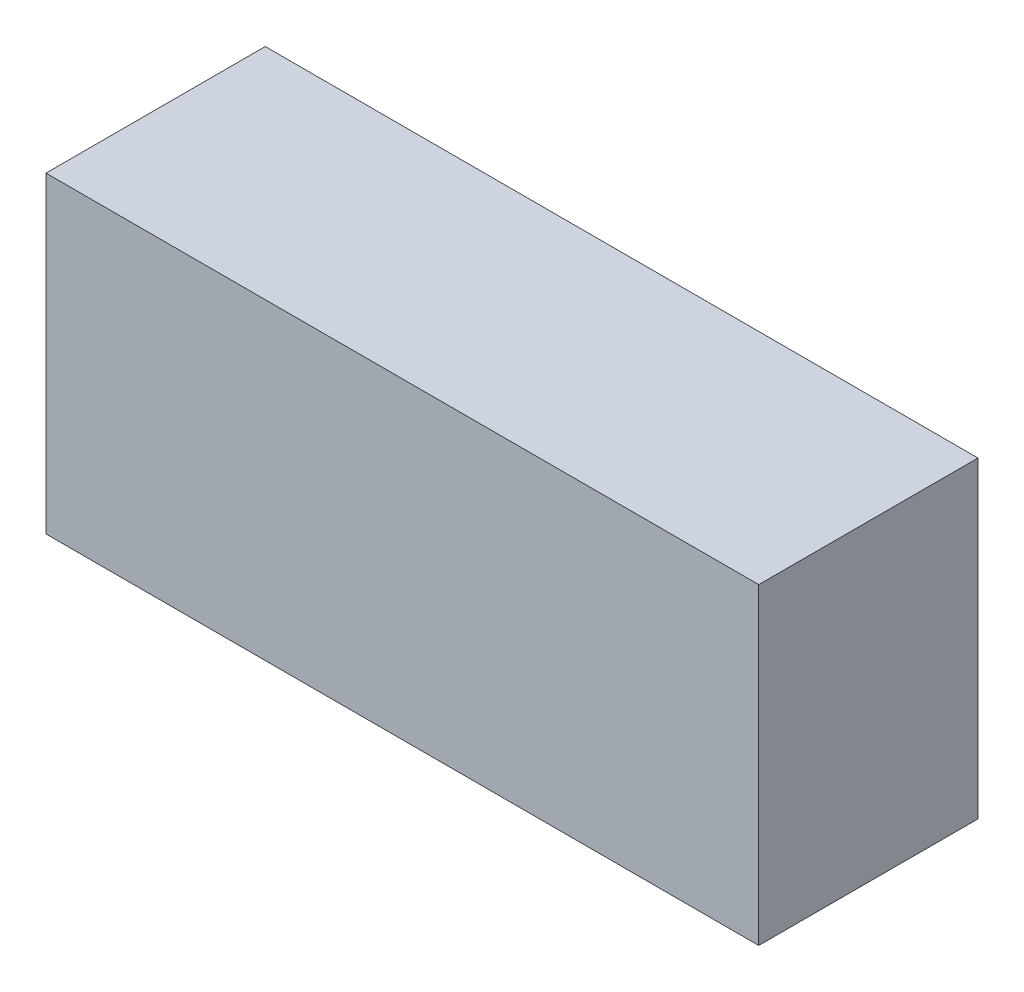
ISO-10303-21;
HEADER;
FILE_DESCRIPTION(('STEP AP214'),'2;1');
FILE_NAME('part.step','',(''),(''),'','','');
FILE_SCHEMA(('AUTOMOTIVE_DESIGN { 1 0 10303 214 1 1 1 1 }'));
ENDSEC;
DATA;
#1=APPLICATION_CONTEXT('core data for automotive mechanical design processes');
#2=APPLICATION_PROTOCOL_DEFINITION('international standard','automotive_design',2000,#1);
#3=PRODUCT_CONTEXT('',#1,'mechanical');
#4=PRODUCT('Part','Part','',(#3));
#5=PRODUCT_RELATED_PRODUCT_CATEGORY('part','',(#4));
#6=PRODUCT_DEFINITION_FORMATION('','',#4);
#7=PRODUCT_DEFINITION_CONTEXT('part definition',#1,'design');
#8=PRODUCT_DEFINITION('design','',#6,#7);
#9=PRODUCT_DEFINITION_SHAPE('','',#8);
#10=(LENGTH_UNIT() NAMED_UNIT(*) SI_UNIT(.MILLI.,.METRE.));
#11=(NAMED_UNIT(*) PLANE_ANGLE_UNIT() SI_UNIT($,.RADIAN.));
#12=(NAMED_UNIT(*) SI_UNIT($,.STERADIAN.) SOLID_ANGLE_UNIT());
#13=UNCERTAINTY_MEASURE_WITH_UNIT(LENGTH_MEASURE(1.E-05),#10,'distance_accuracy_value','');
#14=(GEOMETRIC_REPRESENTATION_CONTEXT(3) GLOBAL_UNCERTAINTY_ASSIGNED_CONTEXT((#13)) GLOBAL_UNIT_ASSIGNED_CONTEXT((#10,
#11,#12)) REPRESENTATION_CONTEXT('',''));
#15=CARTESIAN_POINT('',(0.,0.,0.));
#16=DIRECTION('',(0.,0.,1.));
#17=DIRECTION('',(1.,0.,0.));
#18=AXIS2_PLACEMENT_3D('',#15,#16,#17);
#19=CARTESIAN_POINT('',(-1.6254,-0.7,1.));
#20=DIRECTION('',(1.,0.,0.));
#21=DIRECTION('',(0.,0.,-1.));
#22=AXIS2_PLACEMENT_3D('',#19,#20,#21);
#23=PLANE('',#22);
#24=DIRECTION('',(0.,-1.,0.));
#25=VECTOR('',#24,1.);
#26=CARTESIAN_POINT('',(-1.6254,-0.7,0.));
#27=LINE('',#26,#25);
#28=CARTESIAN_POINT('',(-1.6254,0.7254,0.));
#29=VERTEX_POINT('',#28);
#30=CARTESIAN_POINT('',(-1.6254,-0.7,0.));
#31=VERTEX_POINT('',#30);
#32=EDGE_CURVE('E96',#29,#31,#27,.T.);
#33=ORIENTED_EDGE('',*,*,#32,.T.);
#34=DIRECTION('',(0.,0.,-1.));
#35=VECTOR('',#34,1.);
#36=CARTESIAN_POINT('',(-1.6254,-0.7,1.));
#37=LINE('',#36,#35);
#38=CARTESIAN_POINT('',(-1.6254,-0.7,1.));
#39=VERTEX_POINT('',#38);
#40=EDGE_CURVE('E11',#39,#31,#37,.T.);
#41=ORIENTED_EDGE('',*,*,#40,.F.);
#42=DIRECTION('',(0.,-1.,0.));
#43=VECTOR('',#42,1.);
#44=CARTESIAN_POINT('',(-1.6254,-0.7,1.));
#45=LINE('',#44,#43);
#46=CARTESIAN_POINT('',(-1.6254,0.7254,1.));
#47=VERTEX_POINT('',#46);
#48=EDGE_CURVE('E84',#47,#39,#45,.T.);
#49=ORIENTED_EDGE('',*,*,#48,.F.);
#50=DIRECTION('',(0.,0.,-1.));
#51=VECTOR('',#50,1.);
#52=CARTESIAN_POINT('',(-1.6254,0.7254,1.));
#53=LINE('',#52,#51);
#54=EDGE_CURVE('E92',#47,#29,#53,.T.);
#55=ORIENTED_EDGE('',*,*,#54,.T.);
#56=EDGE_LOOP('',(#33,#41,#49,#55));
#57=FACE_BOUND('',#56,.T.);
#58=ADVANCED_FACE('F33',(#57),#23,.F.);
#59=CARTESIAN_POINT('',(1.6254,-0.7,1.));
#60=DIRECTION('',(0.,1.,0.));
#61=DIRECTION('',(0.,0.,1.));
#62=AXIS2_PLACEMENT_3D('',#59,#60,#61);
#63=PLANE('',#62);
#64=DIRECTION('',(1.,0.,0.));
#65=VECTOR('',#64,1.);
#66=CARTESIAN_POINT('',(1.6254,-0.7,0.));
#67=LINE('',#66,#65);
#68=CARTESIAN_POINT('',(1.6254,-0.7,0.));
#69=VERTEX_POINT('',#68);
#70=EDGE_CURVE('E88',#31,#69,#67,.T.);
#71=ORIENTED_EDGE('',*,*,#70,.T.);
#72=DIRECTION('',(0.,0.,-1.));
#73=VECTOR('',#72,1.);
#74=CARTESIAN_POINT('',(1.6254,-0.7,1.));
#75=LINE('',#74,#73);
#76=CARTESIAN_POINT('',(1.6254,-0.7,1.));
#77=VERTEX_POINT('',#76);
#78=EDGE_CURVE('E41',#77,#69,#75,.T.);
#79=ORIENTED_EDGE('',*,*,#78,.F.);
#80=DIRECTION('',(1.,0.,0.));
#81=VECTOR('',#80,1.);
#82=CARTESIAN_POINT('',(1.6254,-0.7,1.));
#83=LINE('',#82,#81);
#84=EDGE_CURVE('E79',#39,#77,#83,.T.);
#85=ORIENTED_EDGE('',*,*,#84,.F.);
#86=ORIENTED_EDGE('',*,*,#40,.T.);
#87=EDGE_LOOP('',(#71,#79,#85,#86));
#88=FACE_BOUND('',#87,.T.);
#89=ADVANCED_FACE('F87',(#88),#63,.F.);
#90=CARTESIAN_POINT('',(1.6254,0.7254,1.));
#91=DIRECTION('',(-1.,0.,0.));
#92=DIRECTION('',(0.,0.,1.));
#93=AXIS2_PLACEMENT_3D('',#90,#91,#92);
#94=PLANE('',#93);
#95=DIRECTION('',(0.,1.,0.));
#96=VECTOR('',#95,1.);
#97=CARTESIAN_POINT('',(1.6254,0.7254,0.));
#98=LINE('',#97,#96);
#99=CARTESIAN_POINT('',(1.6254,0.7254,0.));
#100=VERTEX_POINT('',#99);
#101=EDGE_CURVE('E66',#69,#100,#98,.T.);
#102=ORIENTED_EDGE('',*,*,#101,.T.);
#103=DIRECTION('',(0.,0.,-1.));
#104=VECTOR('',#103,1.);
#105=CARTESIAN_POINT('',(1.6254,0.7254,1.));
#106=LINE('',#105,#104);
#107=CARTESIAN_POINT('',(1.6254,0.7254,1.));
#108=VERTEX_POINT('',#107);
#109=EDGE_CURVE('E89',#108,#100,#106,.T.);
#110=ORIENTED_EDGE('',*,*,#109,.F.);
#111=DIRECTION('',(0.,1.,0.));
#112=VECTOR('',#111,1.);
#113=CARTESIAN_POINT('',(1.6254,0.7254,1.));
#114=LINE('',#113,#112);
#115=EDGE_CURVE('E82',#77,#108,#114,.T.);
#116=ORIENTED_EDGE('',*,*,#115,.F.);
#117=ORIENTED_EDGE('',*,*,#78,.T.);
#118=EDGE_LOOP('',(#102,#110,#116,#117));
#119=FACE_BOUND('',#118,.T.);
#120=ADVANCED_FACE('F90',(#119),#94,.F.);
#121=CARTESIAN_POINT('',(-1.6254,0.7254,1.));
#122=DIRECTION('',(0.,-1.,0.));
#123=DIRECTION('',(0.,0.,-1.));
#124=AXIS2_PLACEMENT_3D('',#121,#122,#123);
#125=PLANE('',#124);
#126=DIRECTION('',(-1.,0.,0.));
#127=VECTOR('',#126,1.);
#128=CARTESIAN_POINT('',(-1.6254,0.7254,0.));
#129=LINE('',#128,#127);
#130=EDGE_CURVE('E72',#100,#29,#129,.T.);
#131=ORIENTED_EDGE('',*,*,#130,.T.);
#132=ORIENTED_EDGE('',*,*,#54,.F.);
#133=DIRECTION('',(-1.,0.,0.));
#134=VECTOR('',#133,1.);
#135=CARTESIAN_POINT('',(-1.6254,0.7254,1.));
#136=LINE('',#135,#134);
#137=EDGE_CURVE('E49',#108,#47,#136,.T.);
#138=ORIENTED_EDGE('',*,*,#137,.F.);
#139=ORIENTED_EDGE('',*,*,#109,.T.);
#140=EDGE_LOOP('',(#131,#132,#138,#139));
#141=FACE_BOUND('',#140,.T.);
#142=ADVANCED_FACE('F103',(#141),#125,.F.);
#143=CARTESIAN_POINT('',(0.,0.,1.));
#144=DIRECTION('',(0.,0.,-1.));
#145=DIRECTION('',(-1.,0.,0.));
#146=AXIS2_PLACEMENT_3D('',#143,#144,#145);
#147=PLANE('',#146);
#148=ORIENTED_EDGE('',*,*,#48,.T.);
#149=ORIENTED_EDGE('',*,*,#84,.T.);
#150=ORIENTED_EDGE('',*,*,#115,.T.);
#151=ORIENTED_EDGE('',*,*,#137,.T.);
#152=EDGE_LOOP('',(#148,#149,#150,#151));
#153=FACE_BOUND('',#152,.T.);
#154=ADVANCED_FACE('F80',(#153),#147,.F.);
#155=CARTESIAN_POINT('',(0.,0.,0.));
#156=DIRECTION('',(0.,0.,-1.));
#157=DIRECTION('',(-1.,0.,0.));
#158=AXIS2_PLACEMENT_3D('',#155,#156,#157);
#159=PLANE('',#158);
#160=ORIENTED_EDGE('',*,*,#32,.F.);
#161=ORIENTED_EDGE('',*,*,#130,.F.);
#162=ORIENTED_EDGE('',*,*,#101,.F.);
#163=ORIENTED_EDGE('',*,*,#70,.F.);
#164=EDGE_LOOP('',(#160,#161,#162,#163));
#165=FACE_BOUND('',#164,.T.);
#166=ADVANCED_FACE('F106',(#165),#159,.T.);
#167=CLOSED_SHELL('',(#58,#89,#120,#142,#154,#166));
#168=MANIFOLD_SOLID_BREP('B2',#167);
#169=ADVANCED_BREP_SHAPE_REPRESENTATION('',(#18,#168),#14);
#170=SHAPE_DEFINITION_REPRESENTATION(#9,#169);
ENDSEC;
END-ISO-10303-21;
